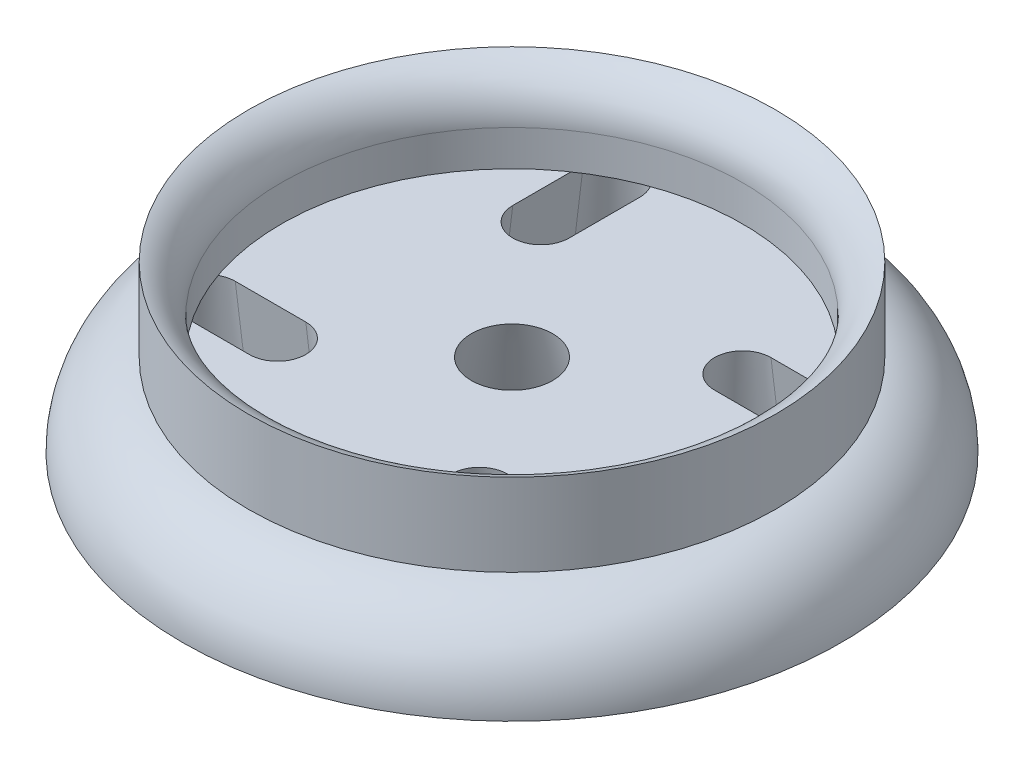
ISO-10303-21;
HEADER;
FILE_DESCRIPTION(('STEP AP214'),'2;1');
FILE_NAME('part.step','',(''),(''),'','','');
FILE_SCHEMA(('AUTOMOTIVE_DESIGN { 1 0 10303 214 1 1 1 1 }'));
ENDSEC;
DATA;
#1=APPLICATION_CONTEXT('core data for automotive mechanical design processes');
#2=APPLICATION_PROTOCOL_DEFINITION('international standard','automotive_design',2000,#1);
#3=PRODUCT_CONTEXT('',#1,'mechanical');
#4=PRODUCT('Part','Part','',(#3));
#5=PRODUCT_RELATED_PRODUCT_CATEGORY('part','',(#4));
#6=PRODUCT_DEFINITION_FORMATION('','',#4);
#7=PRODUCT_DEFINITION_CONTEXT('part definition',#1,'design');
#8=PRODUCT_DEFINITION('design','',#6,#7);
#9=PRODUCT_DEFINITION_SHAPE('','',#8);
#10=(LENGTH_UNIT() NAMED_UNIT(*) SI_UNIT(.MILLI.,.METRE.));
#11=(NAMED_UNIT(*) PLANE_ANGLE_UNIT() SI_UNIT($,.RADIAN.));
#12=(NAMED_UNIT(*) SI_UNIT($,.STERADIAN.) SOLID_ANGLE_UNIT());
#13=UNCERTAINTY_MEASURE_WITH_UNIT(LENGTH_MEASURE(1.E-05),#10,'distance_accuracy_value','');
#14=(GEOMETRIC_REPRESENTATION_CONTEXT(3) GLOBAL_UNCERTAINTY_ASSIGNED_CONTEXT((#13)) GLOBAL_UNIT_ASSIGNED_CONTEXT((#10,
#11,#12)) REPRESENTATION_CONTEXT('',''));
#15=CARTESIAN_POINT('',(0.,0.,0.));
#16=DIRECTION('',(0.,0.,1.));
#17=DIRECTION('',(1.,0.,0.));
#18=AXIS2_PLACEMENT_3D('',#15,#16,#17);
#19=CARTESIAN_POINT('',(0.,5.,0.));
#20=DIRECTION('',(0.,1.,0.));
#21=DIRECTION('',(0.,0.,1.));
#22=AXIS2_PLACEMENT_3D('',#19,#20,#21);
#23=PLANE('',#22);
#24=CARTESIAN_POINT('',(0.,5.,0.));
#25=DIRECTION('',(0.,1.,0.));
#26=DIRECTION('',(1.,0.,0.));
#27=AXIS2_PLACEMENT_3D('',#24,#25,#26);
#28=CIRCLE('',#27,16.);
#29=CARTESIAN_POINT('',(16.,5.,0.));
#30=VERTEX_POINT('',#29);
#31=EDGE_CURVE('E58',#30,#30,#28,.T.);
#32=ORIENTED_EDGE('',*,*,#31,.F.);
#33=EDGE_LOOP('',(#32));
#34=FACE_BOUND('',#33,.T.);
#35=CARTESIAN_POINT('',(0.,5.,0.));
#36=DIRECTION('',(0.,1.,0.));
#37=DIRECTION('',(0.,0.,1.));
#38=AXIS2_PLACEMENT_3D('',#35,#36,#37);
#39=CIRCLE('',#38,14.);
#40=CARTESIAN_POINT('',(0.,5.,14.));
#41=VERTEX_POINT('',#40);
#42=EDGE_CURVE('E63',#41,#41,#39,.T.);
#43=ORIENTED_EDGE('',*,*,#42,.T.);
#44=EDGE_LOOP('',(#43));
#45=FACE_BOUND('',#44,.T.);
#46=ADVANCED_FACE('F47',(#34,#45),#23,.F.);
#47=CARTESIAN_POINT('',(0.,10.,0.));
#48=DIRECTION('',(0.,-1.,0.));
#49=DIRECTION('',(0.,0.,-1.));
#50=AXIS2_PLACEMENT_3D('',#47,#48,#49);
#51=CYLINDRICAL_SURFACE('',#50,16.);
#52=CARTESIAN_POINT('',(0.,10.,0.));
#53=DIRECTION('',(0.,1.,0.));
#54=DIRECTION('',(1.,0.,0.));
#55=AXIS2_PLACEMENT_3D('',#52,#53,#54);
#56=CIRCLE('',#55,16.);
#57=CARTESIAN_POINT('',(16.,10.,0.));
#58=VERTEX_POINT('',#57);
#59=EDGE_CURVE('E54',#58,#58,#56,.T.);
#60=ORIENTED_EDGE('',*,*,#59,.F.);
#61=EDGE_LOOP('',(#60));
#62=FACE_BOUND('',#61,.T.);
#63=ORIENTED_EDGE('',*,*,#31,.T.);
#64=EDGE_LOOP('',(#63));
#65=FACE_BOUND('',#64,.T.);
#66=ADVANCED_FACE('F71',(#62,#65),#51,.T.);
#67=CARTESIAN_POINT('',(0.,10.,0.));
#68=DIRECTION('',(0.,-1.,0.));
#69=DIRECTION('',(0.,0.,-1.));
#70=AXIS2_PLACEMENT_3D('',#67,#68,#69);
#71=CYLINDRICAL_SURFACE('',#70,14.);
#72=CARTESIAN_POINT('',(0.,7.17157287525381,0.));
#73=DIRECTION('',(0.,1.,0.));
#74=DIRECTION('',(0.,0.,1.));
#75=AXIS2_PLACEMENT_3D('',#72,#73,#74);
#76=CIRCLE('',#75,14.);
#77=CARTESIAN_POINT('',(0.,7.17157287525381,14.));
#78=VERTEX_POINT('',#77);
#79=EDGE_CURVE('E12',#78,#78,#76,.T.);
#80=ORIENTED_EDGE('',*,*,#79,.T.);
#81=EDGE_LOOP('',(#80));
#82=FACE_BOUND('',#81,.T.);
#83=ORIENTED_EDGE('',*,*,#42,.F.);
#84=EDGE_LOOP('',(#83));
#85=FACE_BOUND('',#84,.T.);
#86=ADVANCED_FACE('F69',(#82,#85),#71,.F.);
#87=CARTESIAN_POINT('',(0.,7.17157287525381,0.));
#88=DIRECTION('',(0.,1.,0.));
#89=DIRECTION('',(0.,0.,1.));
#90=AXIS2_PLACEMENT_3D('',#87,#88,#89);
#91=TOROIDAL_SURFACE('',#90,17.,3.);
#92=ORIENTED_EDGE('',*,*,#59,.T.);
#93=EDGE_LOOP('',(#92));
#94=FACE_BOUND('',#93,.T.);
#95=ORIENTED_EDGE('',*,*,#79,.F.);
#96=EDGE_LOOP('',(#95));
#97=FACE_BOUND('',#96,.T.);
#98=ADVANCED_FACE('F49',(#94,#97),#91,.T.);
#99=CLOSED_SHELL('',(#46,#66,#86,#98));
#100=MANIFOLD_SOLID_BREP('B2',#99);
#101=CARTESIAN_POINT('',(0.,5.,0.));
#102=DIRECTION('',(0.,1.,0.));
#103=DIRECTION('',(0.,0.,1.));
#104=AXIS2_PLACEMENT_3D('',#101,#102,#103);
#105=PLANE('',#104);
#106=CARTESIAN_POINT('',(0.,5.,0.));
#107=DIRECTION('',(0.,1.,0.));
#108=DIRECTION('',(0.,0.,1.));
#109=AXIS2_PLACEMENT_3D('',#106,#107,#108);
#110=CIRCLE('',#109,2.46735385671982);
#111=CARTESIAN_POINT('',(0.,5.,2.46735385671982));
#112=VERTEX_POINT('',#111);
#113=EDGE_CURVE('E295',#112,#112,#110,.F.);
#114=ORIENTED_EDGE('',*,*,#113,.T.);
#115=EDGE_LOOP('',(#114));
#116=FACE_BOUND('',#115,.T.);
#117=CARTESIAN_POINT('',(12.1577030932826,5.,-6.12256372093332));
#118=DIRECTION('',(0.,1.,0.));
#119=DIRECTION('',(0.,0.,1.));
#120=AXIS2_PLACEMENT_3D('',#117,#118,#119);
#121=CIRCLE('',#120,1.71192932573659);
#122=CARTESIAN_POINT('',(12.8910571703802,5.,-7.66946184748246));
#123=VERTEX_POINT('',#122);
#124=CARTESIAN_POINT('',(12.1577030932826,5.,-7.83449304666991));
#125=VERTEX_POINT('',#124);
#126=EDGE_CURVE('E263',#123,#125,#121,.T.);
#127=ORIENTED_EDGE('',*,*,#126,.F.);
#128=CARTESIAN_POINT('',(0.,5.,0.));
#129=DIRECTION('',(0.,1.,0.));
#130=DIRECTION('',(0.,0.,1.));
#131=AXIS2_PLACEMENT_3D('',#128,#129,#130);
#132=CIRCLE('',#131,15.);
#133=CARTESIAN_POINT('',(-5.67121512916961,5.,-13.8865877363259));
#134=VERTEX_POINT('',#133);
#135=EDGE_CURVE('E331',#123,#134,#132,.T.);
#136=ORIENTED_EDGE('',*,*,#135,.T.);
#137=CARTESIAN_POINT('',(-6.23502692176227,5.,-12.2701662941116));
#138=DIRECTION('',(0.,1.,0.));
#139=DIRECTION('',(0.,0.,1.));
#140=AXIS2_PLACEMENT_3D('',#137,#138,#139);
#141=CIRCLE('',#140,1.71192932573659);
#142=CARTESIAN_POINT('',(-4.52309759602568,5.,-12.2701662941116));
#143=VERTEX_POINT('',#142);
#144=EDGE_CURVE('E300',#143,#134,#141,.T.);
#145=ORIENTED_EDGE('',*,*,#144,.F.);
#146=DIRECTION('',(0.,0.,-1.));
#147=VECTOR('',#146,1.);
#148=CARTESIAN_POINT('',(-4.52309759602571,5.,0.));
#149=LINE('',#148,#147);
#150=CARTESIAN_POINT('',(-4.52309759602568,5.,-7.99251536859424));
#151=VERTEX_POINT('',#150);
#152=EDGE_CURVE('E404',#143,#151,#149,.F.);
#153=ORIENTED_EDGE('',*,*,#152,.T.);
#154=CARTESIAN_POINT('',(-6.23502692176227,5.,-7.99251536859424));
#155=DIRECTION('',(0.,1.,0.));
#156=DIRECTION('',(0.,0.,1.));
#157=AXIS2_PLACEMENT_3D('',#154,#155,#156);
#158=CIRCLE('',#157,1.71192932573659);
#159=CARTESIAN_POINT('',(-7.94695624749887,5.,-7.99251536859424));
#160=VERTEX_POINT('',#159);
#161=EDGE_CURVE('E407',#160,#151,#158,.T.);
#162=ORIENTED_EDGE('',*,*,#161,.F.);
#163=DIRECTION('',(0.,0.,1.));
#164=VECTOR('',#163,1.);
#165=CARTESIAN_POINT('',(-7.94695624749888,5.,0.));
#166=LINE('',#165,#164);
#167=CARTESIAN_POINT('',(-7.94695624749886,5.,-12.2701662941116));
#168=VERTEX_POINT('',#167);
#169=EDGE_CURVE('E410',#168,#160,#166,.T.);
#170=ORIENTED_EDGE('',*,*,#169,.F.);
#171=CARTESIAN_POINT('',(-6.23502692176227,5.,-12.2701662941116));
#172=DIRECTION('',(0.,1.,0.));
#173=DIRECTION('',(0.,0.,1.));
#174=AXIS2_PLACEMENT_3D('',#171,#172,#173);
#175=CIRCLE('',#174,1.71192932573659);
#176=CARTESIAN_POINT('',(-7.87305253723181,5.,-12.7677344797731));
#177=VERTEX_POINT('',#176);
#178=EDGE_CURVE('E403',#177,#168,#175,.T.);
#179=ORIENTED_EDGE('',*,*,#178,.F.);
#180=CARTESIAN_POINT('',(0.,5.,0.));
#181=DIRECTION('',(0.,1.,0.));
#182=DIRECTION('',(0.,0.,1.));
#183=AXIS2_PLACEMENT_3D('',#180,#181,#182);
#184=CIRCLE('',#183,15.);
#185=CARTESIAN_POINT('',(-13.9662103810918,5.,5.47219952040162));
#186=VERTEX_POINT('',#185);
#187=EDGE_CURVE('E329',#177,#186,#184,.T.);
#188=ORIENTED_EDGE('',*,*,#187,.T.);
#189=CARTESIAN_POINT('',(-12.3826294949405,5.,6.1225637209333));
#190=DIRECTION('',(0.,1.,0.));
#191=DIRECTION('',(0.,0.,1.));
#192=AXIS2_PLACEMENT_3D('',#189,#190,#191);
#193=CIRCLE('',#192,1.71192932573659);
#194=CARTESIAN_POINT('',(-12.3826294949405,5.,4.41063439519671));
#195=VERTEX_POINT('',#194);
#196=EDGE_CURVE('E389',#195,#186,#193,.T.);
#197=ORIENTED_EDGE('',*,*,#196,.F.);
#198=DIRECTION('',(-1.,0.,0.));
#199=VECTOR('',#198,1.);
#200=CARTESIAN_POINT('',(-12.3826294949405,5.,4.41063439519671));
#201=LINE('',#200,#199);
#202=CARTESIAN_POINT('',(-8.10497856942318,5.,4.4106343951967));
#203=VERTEX_POINT('',#202);
#204=EDGE_CURVE('E385',#195,#203,#201,.F.);
#205=ORIENTED_EDGE('',*,*,#204,.T.);
#206=CARTESIAN_POINT('',(-8.10497856942318,5.,6.12256372093329));
#207=DIRECTION('',(0.,1.,0.));
#208=DIRECTION('',(0.,0.,1.));
#209=AXIS2_PLACEMENT_3D('',#206,#207,#208);
#210=CIRCLE('',#209,1.71192932573659);
#211=CARTESIAN_POINT('',(-8.10497856942318,5.,7.83449304666989));
#212=VERTEX_POINT('',#211);
#213=EDGE_CURVE('E388',#212,#203,#210,.T.);
#214=ORIENTED_EDGE('',*,*,#213,.F.);
#215=DIRECTION('',(1.,0.,0.));
#216=VECTOR('',#215,1.);
#217=CARTESIAN_POINT('',(-12.3826294949405,5.,7.83449304666989));
#218=LINE('',#217,#216);
#219=CARTESIAN_POINT('',(-12.3826294949405,5.,7.83449304666989));
#220=VERTEX_POINT('',#219);
#221=EDGE_CURVE('E283',#220,#212,#218,.T.);
#222=ORIENTED_EDGE('',*,*,#221,.F.);
#223=CARTESIAN_POINT('',(-12.3826294949405,5.,6.1225637209333));
#224=DIRECTION('',(0.,1.,0.));
#225=DIRECTION('',(0.,0.,1.));
#226=AXIS2_PLACEMENT_3D('',#223,#224,#225);
#227=CIRCLE('',#226,1.71192932573659);
#228=CARTESIAN_POINT('',(-12.8272228758326,5.,7.77575419452789));
#229=VERTEX_POINT('',#228);
#230=EDGE_CURVE('E392',#229,#220,#227,.T.);
#231=ORIENTED_EDGE('',*,*,#230,.F.);
#232=CARTESIAN_POINT('',(0.,5.,0.));
#233=DIRECTION('',(0.,1.,0.));
#234=DIRECTION('',(0.,0.,1.));
#235=AXIS2_PLACEMENT_3D('',#232,#233,#234);
#236=CIRCLE('',#235,15.);
#237=CARTESIAN_POINT('',(5.57441685301844,5.,13.9257271533225));
#238=VERTEX_POINT('',#237);
#239=EDGE_CURVE('E327',#229,#238,#236,.T.);
#240=ORIENTED_EDGE('',*,*,#239,.T.);
#241=CARTESIAN_POINT('',(6.01010052010435,5.,12.2701662941115));
#242=DIRECTION('',(0.,1.,0.));
#243=DIRECTION('',(0.,0.,1.));
#244=AXIS2_PLACEMENT_3D('',#241,#242,#243);
#245=CIRCLE('',#244,1.71192932573659);
#246=CARTESIAN_POINT('',(4.29817119436776,5.,12.2701662941115));
#247=VERTEX_POINT('',#246);
#248=EDGE_CURVE('E375',#247,#238,#245,.T.);
#249=ORIENTED_EDGE('',*,*,#248,.F.);
#250=DIRECTION('',(0.,0.,1.));
#251=VECTOR('',#250,1.);
#252=CARTESIAN_POINT('',(4.29817119436777,5.,0.));
#253=LINE('',#252,#251);
#254=CARTESIAN_POINT('',(4.29817119436776,5.,7.9925153685942));
#255=VERTEX_POINT('',#254);
#256=EDGE_CURVE('E378',#247,#255,#253,.F.);
#257=ORIENTED_EDGE('',*,*,#256,.T.);
#258=CARTESIAN_POINT('',(6.01010052010435,5.,7.9925153685942));
#259=DIRECTION('',(0.,1.,0.));
#260=DIRECTION('',(0.,0.,1.));
#261=AXIS2_PLACEMENT_3D('',#258,#259,#260);
#262=CIRCLE('',#261,1.71192932573659);
#263=CARTESIAN_POINT('',(7.72202984584095,5.,7.9925153685942));
#264=VERTEX_POINT('',#263);
#265=EDGE_CURVE('E381',#264,#255,#262,.T.);
#266=ORIENTED_EDGE('',*,*,#265,.F.);
#267=DIRECTION('',(0.,0.,-1.));
#268=VECTOR('',#267,1.);
#269=CARTESIAN_POINT('',(7.72202984584096,5.,0.));
#270=LINE('',#269,#268);
#271=CARTESIAN_POINT('',(7.72202984584094,5.,12.2701662941115));
#272=VERTEX_POINT('',#271);
#273=EDGE_CURVE('E384',#272,#264,#270,.T.);
#274=ORIENTED_EDGE('',*,*,#273,.F.);
#275=CARTESIAN_POINT('',(6.01010052010435,5.,12.2701662941115));
#276=DIRECTION('',(0.,1.,0.));
#277=DIRECTION('',(0.,0.,1.));
#278=AXIS2_PLACEMENT_3D('',#275,#276,#277);
#279=CIRCLE('',#278,1.71192932573659);
#280=CARTESIAN_POINT('',(7.58519638980334,5.,12.940818974397));
#281=VERTEX_POINT('',#280);
#282=EDGE_CURVE('E320',#281,#272,#279,.T.);
#283=ORIENTED_EDGE('',*,*,#282,.F.);
#284=CARTESIAN_POINT('',(0.,5.,0.));
#285=DIRECTION('',(0.,1.,0.));
#286=DIRECTION('',(0.,0.,1.));
#287=AXIS2_PLACEMENT_3D('',#284,#285,#286);
#288=CIRCLE('',#287,15.);
#289=CARTESIAN_POINT('',(13.837167813735,5.00000000000002,-5.79075011501463));
#290=VERTEX_POINT('',#289);
#291=EDGE_CURVE('E324',#281,#290,#288,.T.);
#292=ORIENTED_EDGE('',*,*,#291,.T.);
#293=CARTESIAN_POINT('',(12.1577030932826,5.,-6.12256372093332));
#294=DIRECTION('',(0.,1.,0.));
#295=DIRECTION('',(0.,0.,1.));
#296=AXIS2_PLACEMENT_3D('',#293,#294,#295);
#297=CIRCLE('',#296,1.71192932573659);
#298=CARTESIAN_POINT('',(12.1577030932826,5.,-4.41063439519673));
#299=VERTEX_POINT('',#298);
#300=EDGE_CURVE('E255',#299,#290,#297,.T.);
#301=ORIENTED_EDGE('',*,*,#300,.F.);
#302=DIRECTION('',(1.,0.,0.));
#303=VECTOR('',#302,1.);
#304=CARTESIAN_POINT('',(0.,5.,-4.41063439519676));
#305=LINE('',#304,#303);
#306=CARTESIAN_POINT('',(7.88005216776526,5.,-4.41063439519674));
#307=VERTEX_POINT('',#306);
#308=EDGE_CURVE('E340',#299,#307,#305,.F.);
#309=ORIENTED_EDGE('',*,*,#308,.T.);
#310=CARTESIAN_POINT('',(7.88005216776526,5.,-6.12256372093333));
#311=DIRECTION('',(0.,1.,0.));
#312=DIRECTION('',(0.,0.,1.));
#313=AXIS2_PLACEMENT_3D('',#310,#311,#312);
#314=CIRCLE('',#313,1.71192932573659);
#315=CARTESIAN_POINT('',(7.88005216776526,5.,-7.83449304666993));
#316=VERTEX_POINT('',#315);
#317=EDGE_CURVE('E338',#316,#307,#314,.T.);
#318=ORIENTED_EDGE('',*,*,#317,.F.);
#319=DIRECTION('',(-1.,0.,0.));
#320=VECTOR('',#319,1.);
#321=CARTESIAN_POINT('',(0.,5.,-7.83449304666995));
#322=LINE('',#321,#320);
#323=EDGE_CURVE('E336',#125,#316,#322,.T.);
#324=ORIENTED_EDGE('',*,*,#323,.F.);
#325=EDGE_LOOP('',(#127,#136,#145,#153,#162,#170,#179,#188,#197,#205,#214,#222,#231,#240,#249,
#257,#266,#274,#283,#292,#301,#309,#318,#324));
#326=FACE_BOUND('',#325,.T.);
#327=ADVANCED_FACE('F109',(#116,#326),#105,.T.);
#328=CARTESIAN_POINT('',(0.,0.,0.));
#329=DIRECTION('',(0.,1.,0.));
#330=DIRECTION('',(0.,0.,1.));
#331=AXIS2_PLACEMENT_3D('',#328,#329,#330);
#332=PLANE('',#331);
#333=CARTESIAN_POINT('',(0.,0.,0.));
#334=DIRECTION('',(0.,-1.,0.));
#335=DIRECTION('',(0.,0.,-1.));
#336=AXIS2_PLACEMENT_3D('',#333,#334,#335);
#337=CIRCLE('',#336,3.80709981887543);
#338=CARTESIAN_POINT('',(0.,0.,-3.80709981887543));
#339=VERTEX_POINT('',#338);
#340=EDGE_CURVE('E291',#339,#339,#337,.T.);
#341=ORIENTED_EDGE('',*,*,#340,.F.);
#342=EDGE_LOOP('',(#341));
#343=FACE_BOUND('',#342,.T.);
#344=CARTESIAN_POINT('',(12.1577030932826,0.,-6.12256372093332));
#345=DIRECTION('',(0.,-1.,0.));
#346=DIRECTION('',(0.,0.,-1.));
#347=AXIS2_PLACEMENT_3D('',#344,#345,#346);
#348=CIRCLE('',#347,2.32585213025111);
#349=CARTESIAN_POINT('',(12.1577030932826,0.,-3.79671159068221));
#350=VERTEX_POINT('',#349);
#351=CARTESIAN_POINT('',(12.1577030932826,0.,-8.44841585118444));
#352=VERTEX_POINT('',#351);
#353=EDGE_CURVE('E260',#350,#352,#348,.F.);
#354=ORIENTED_EDGE('',*,*,#353,.T.);
#355=DIRECTION('',(-1.,0.,0.));
#356=VECTOR('',#355,1.);
#357=CARTESIAN_POINT('',(0.,0.,-8.44841585118448));
#358=LINE('',#357,#356);
#359=CARTESIAN_POINT('',(7.88005216776526,0.,-8.44841585118445));
#360=VERTEX_POINT('',#359);
#361=EDGE_CURVE('E243',#352,#360,#358,.T.);
#362=ORIENTED_EDGE('',*,*,#361,.T.);
#363=CARTESIAN_POINT('',(7.88005216776526,0.,-6.12256372093333));
#364=DIRECTION('',(0.,-1.,0.));
#365=DIRECTION('',(0.,0.,-1.));
#366=AXIS2_PLACEMENT_3D('',#363,#364,#365);
#367=CIRCLE('',#366,2.32585213025112);
#368=CARTESIAN_POINT('',(7.88005216776526,0.,-3.79671159068222));
#369=VERTEX_POINT('',#368);
#370=EDGE_CURVE('E254',#360,#369,#367,.F.);
#371=ORIENTED_EDGE('',*,*,#370,.T.);
#372=DIRECTION('',(-1.,0.,0.));
#373=VECTOR('',#372,1.);
#374=CARTESIAN_POINT('',(0.,0.,-3.79671159068224));
#375=LINE('',#374,#373);
#376=EDGE_CURVE('E270',#350,#369,#375,.T.);
#377=ORIENTED_EDGE('',*,*,#376,.F.);
#378=EDGE_LOOP('',(#354,#362,#371,#377));
#379=FACE_BOUND('',#378,.T.);
#380=CARTESIAN_POINT('',(6.01010052010435,0.,12.2701662941115));
#381=DIRECTION('',(0.,-1.,0.));
#382=DIRECTION('',(0.,0.,-1.));
#383=AXIS2_PLACEMENT_3D('',#380,#381,#382);
#384=CIRCLE('',#383,2.32585213025111);
#385=CARTESIAN_POINT('',(3.68424838985324,0.,12.2701662941115));
#386=VERTEX_POINT('',#385);
#387=CARTESIAN_POINT('',(8.33595265035547,0.,12.2701662941115));
#388=VERTEX_POINT('',#387);
#389=EDGE_CURVE('E294',#386,#388,#384,.F.);
#390=ORIENTED_EDGE('',*,*,#389,.T.);
#391=DIRECTION('',(0.,0.,-1.));
#392=VECTOR('',#391,1.);
#393=CARTESIAN_POINT('',(8.33595265035549,0.,0.));
#394=LINE('',#393,#392);
#395=CARTESIAN_POINT('',(8.33595265035548,0.,7.9925153685942));
#396=VERTEX_POINT('',#395);
#397=EDGE_CURVE('E317',#388,#396,#394,.T.);
#398=ORIENTED_EDGE('',*,*,#397,.T.);
#399=CARTESIAN_POINT('',(6.01010052010435,0.,7.9925153685942));
#400=DIRECTION('',(0.,-1.,0.));
#401=DIRECTION('',(0.,0.,-1.));
#402=AXIS2_PLACEMENT_3D('',#399,#400,#401);
#403=CIRCLE('',#402,2.32585213025112);
#404=CARTESIAN_POINT('',(3.68424838985324,0.,7.9925153685942));
#405=VERTEX_POINT('',#404);
#406=EDGE_CURVE('E314',#396,#405,#403,.F.);
#407=ORIENTED_EDGE('',*,*,#406,.T.);
#408=DIRECTION('',(0.,0.,-1.));
#409=VECTOR('',#408,1.);
#410=CARTESIAN_POINT('',(3.68424838985325,0.,0.));
#411=LINE('',#410,#409);
#412=EDGE_CURVE('E311',#386,#405,#411,.T.);
#413=ORIENTED_EDGE('',*,*,#412,.F.);
#414=EDGE_LOOP('',(#390,#398,#407,#413));
#415=FACE_BOUND('',#414,.T.);
#416=CARTESIAN_POINT('',(0.,0.,0.));
#417=DIRECTION('',(0.,1.,0.));
#418=DIRECTION('',(0.,0.,1.));
#419=AXIS2_PLACEMENT_3D('',#416,#417,#418);
#420=CIRCLE('',#419,20.);
#421=CARTESIAN_POINT('',(0.,0.,20.));
#422=VERTEX_POINT('',#421);
#423=EDGE_CURVE('E321',#422,#422,#420,.T.);
#424=ORIENTED_EDGE('',*,*,#423,.F.);
#425=EDGE_LOOP('',(#424));
#426=FACE_BOUND('',#425,.T.);
#427=DIRECTION('',(1.,0.,0.));
#428=VECTOR('',#427,1.);
#429=CARTESIAN_POINT('',(-12.3826294949405,0.,8.44841585118441));
#430=LINE('',#429,#428);
#431=CARTESIAN_POINT('',(-12.3826294949405,0.,8.44841585118441));
#432=VERTEX_POINT('',#431);
#433=CARTESIAN_POINT('',(-8.10497856942318,0.,8.44841585118441));
#434=VERTEX_POINT('',#433);
#435=EDGE_CURVE('E264',#432,#434,#430,.T.);
#436=ORIENTED_EDGE('',*,*,#435,.T.);
#437=CARTESIAN_POINT('',(-8.10497856942318,0.,6.12256372093329));
#438=DIRECTION('',(0.,1.,0.));
#439=DIRECTION('',(0.,0.,1.));
#440=AXIS2_PLACEMENT_3D('',#437,#438,#439);
#441=CIRCLE('',#440,2.32585213025112);
#442=CARTESIAN_POINT('',(-8.10497856942318,0.,3.79671159068218));
#443=VERTEX_POINT('',#442);
#444=EDGE_CURVE('E286',#434,#443,#441,.T.);
#445=ORIENTED_EDGE('',*,*,#444,.T.);
#446=DIRECTION('',(1.,0.,0.));
#447=VECTOR('',#446,1.);
#448=CARTESIAN_POINT('',(-12.3826294949405,0.,3.79671159068218));
#449=LINE('',#448,#447);
#450=CARTESIAN_POINT('',(-12.3826294949405,0.,3.79671159068218));
#451=VERTEX_POINT('',#450);
#452=EDGE_CURVE('E282',#451,#443,#449,.T.);
#453=ORIENTED_EDGE('',*,*,#452,.F.);
#454=CARTESIAN_POINT('',(-12.3826294949405,0.,6.1225637209333));
#455=DIRECTION('',(0.,1.,0.));
#456=DIRECTION('',(0.,0.,1.));
#457=AXIS2_PLACEMENT_3D('',#454,#455,#456);
#458=CIRCLE('',#457,2.32585213025111);
#459=EDGE_CURVE('E279',#451,#432,#458,.T.);
#460=ORIENTED_EDGE('',*,*,#459,.T.);
#461=EDGE_LOOP('',(#436,#445,#453,#460));
#462=FACE_BOUND('',#461,.T.);
#463=CARTESIAN_POINT('',(-6.23502692176227,0.,-12.2701662941116));
#464=DIRECTION('',(0.,-1.,0.));
#465=DIRECTION('',(0.,0.,-1.));
#466=AXIS2_PLACEMENT_3D('',#463,#464,#465);
#467=CIRCLE('',#466,2.32585213025112);
#468=CARTESIAN_POINT('',(-3.90917479151115,0.,-12.2701662941116));
#469=VERTEX_POINT('',#468);
#470=CARTESIAN_POINT('',(-8.56087905201338,0.,-12.2701662941116));
#471=VERTEX_POINT('',#470);
#472=EDGE_CURVE('E306',#469,#471,#467,.F.);
#473=ORIENTED_EDGE('',*,*,#472,.T.);
#474=DIRECTION('',(0.,0.,1.));
#475=VECTOR('',#474,1.);
#476=CARTESIAN_POINT('',(-8.56087905201341,0.,0.));
#477=LINE('',#476,#475);
#478=CARTESIAN_POINT('',(-8.56087905201339,0.,-7.99251536859424));
#479=VERTEX_POINT('',#478);
#480=EDGE_CURVE('E296',#471,#479,#477,.T.);
#481=ORIENTED_EDGE('',*,*,#480,.T.);
#482=CARTESIAN_POINT('',(-6.23502692176227,0.,-7.99251536859424));
#483=DIRECTION('',(0.,-1.,0.));
#484=DIRECTION('',(0.,0.,-1.));
#485=AXIS2_PLACEMENT_3D('',#482,#483,#484);
#486=CIRCLE('',#485,2.32585213025112);
#487=CARTESIAN_POINT('',(-3.90917479151116,0.,-7.99251536859424));
#488=VERTEX_POINT('',#487);
#489=EDGE_CURVE('E299',#479,#488,#486,.F.);
#490=ORIENTED_EDGE('',*,*,#489,.T.);
#491=DIRECTION('',(0.,0.,1.));
#492=VECTOR('',#491,1.);
#493=CARTESIAN_POINT('',(-3.90917479151118,0.,0.));
#494=LINE('',#493,#492);
#495=EDGE_CURVE('E303',#469,#488,#494,.T.);
#496=ORIENTED_EDGE('',*,*,#495,.F.);
#497=EDGE_LOOP('',(#473,#481,#490,#496));
#498=FACE_BOUND('',#497,.T.);
#499=ADVANCED_FACE('F267',(#343,#379,#415,#426,#462,#498),#332,.F.);
#500=CARTESIAN_POINT('',(6.01010052010435,0.,12.2701662941115));
#501=DIRECTION('',(0.,-1.,0.));
#502=DIRECTION('',(0.,0.,-1.));
#503=AXIS2_PLACEMENT_3D('',#500,#501,#502);
#504=CONICAL_SURFACE('',#503,2.32585213025111,0.122173047639603);
#505=ORIENTED_EDGE('',*,*,#248,.T.);
#506=CARTESIAN_POINT('',(5.06577889511161,4.98452486813294,13.7003648796286));
#507=CARTESIAN_POINT('',(5.10629309714609,4.98757905324711,13.7266669040154));
#508=CARTESIAN_POINT('',(5.14789325921203,4.99009186087264,13.7513151431497));
#509=CARTESIAN_POINT('',(5.23300867734325,4.99418367418365,13.7971283600237));
#510=CARTESIAN_POINT('',(5.27652376821847,4.99576276024699,13.818293637475));
#511=CARTESIAN_POINT('',(5.409434434456,4.99931990797488,13.8762501021052));
#512=CARTESIAN_POINT('',(5.50131805532115,5.00012609528134,13.9075815813908));
#513=CARTESIAN_POINT('',(5.68912258611637,4.99984166804454,13.9545476476379));
#514=CARTESIAN_POINT('',(5.78504992203657,4.99874791414757,13.9701561875733));
#515=CARTESIAN_POINT('',(5.97814745504249,4.99582892728244,13.9850435119583));
#516=CARTESIAN_POINT('',(6.0753173668585,4.99400385939048,13.9843259795806));
#517=CARTESIAN_POINT('',(6.26807412199906,4.99058414499301,13.9664784081634));
#518=CARTESIAN_POINT('',(6.36366205549879,4.98898933341361,13.9493601949029));
#519=CARTESIAN_POINT('',(6.55056269144083,4.9866786288792,13.8991436151885));
#520=CARTESIAN_POINT('',(6.64187537939824,4.98596273890184,13.8660451945966));
#521=CARTESIAN_POINT('',(6.816546807475,4.98567457778727,13.785266091404));
#522=CARTESIAN_POINT('',(6.89998387270754,4.98608945502404,13.7377546886369));
#523=CARTESIAN_POINT('',(7.0577152942291,4.98788759163956,13.6293780738309));
#524=CARTESIAN_POINT('',(7.13200624836707,4.98927121009654,13.568507915918));
#525=CARTESIAN_POINT('',(7.26928220581154,4.99247474086946,13.4352742260379));
#526=CARTESIAN_POINT('',(7.33227697073614,4.99429427328189,13.3629207203578));
#527=CARTESIAN_POINT('',(7.44527104072904,4.99752060273851,13.2088470398466));
#528=CARTESIAN_POINT('',(7.49529460373257,4.9989281708569,13.1271447671897));
#529=CARTESIAN_POINT('',(7.55497894411457,4.99985224390401,13.0087548671183));
#530=CARTESIAN_POINT('',(7.57064577756727,4.99999855368216,12.9750136238871));
#531=CARTESIAN_POINT('',(7.58519638980334,5.,12.940818974397));
#532=B_SPLINE_CURVE_WITH_KNOTS('',3,(#506,#507,#508,#509,#510,#511,#512,#513,#514,#515,#516,
#517,#518,#519,#520,#521,#522,#523,#524,#525,#526,#527,#528,#529,#530,#531),.UNSPECIFIED.,.F.,
.F.,(4,2,2,2,2,2,2,2,2,2,2,2,4),(0.,0.145108660779468,0.290204828301863,0.579963314005611,
0.870201035525284,1.16037327987136,1.45033645165732,1.74030060579252,2.02698298383971,
2.31377168123467,2.60031134275367,2.88631120653742,2.99783073912681),.UNSPECIFIED.);
#533=EDGE_CURVE('E119',#238,#281,#532,.T.);
#534=ORIENTED_EDGE('',*,*,#533,.T.);
#535=ORIENTED_EDGE('',*,*,#282,.T.);
#536=DIRECTION('',(-0.121869343405148,0.992546151641322,0.));
#537=VECTOR('',#536,1.);
#538=CARTESIAN_POINT('',(8.33595265035547,0.,12.2701662941115));
#539=LINE('',#538,#537);
#540=EDGE_CURVE('E325',#272,#388,#539,.F.);
#541=ORIENTED_EDGE('',*,*,#540,.T.);
#542=ORIENTED_EDGE('',*,*,#389,.F.);
#543=DIRECTION('',(0.121869343405148,0.992546151641322,0.));
#544=VECTOR('',#543,1.);
#545=CARTESIAN_POINT('',(3.68424838985324,0.,12.2701662941115));
#546=LINE('',#545,#544);
#547=EDGE_CURVE('E523',#247,#386,#546,.F.);
#548=ORIENTED_EDGE('',*,*,#547,.F.);
#549=EDGE_LOOP('',(#505,#534,#535,#541,#542,#548));
#550=FACE_BOUND('',#549,.T.);
#551=ADVANCED_FACE('F358',(#550),#504,.F.);
#552=CARTESIAN_POINT('',(8.33595265035549,0.,0.));
#553=DIRECTION('',(-0.992546151641322,-0.121869343405148,0.));
#554=DIRECTION('',(0.121869343405148,-0.992546151641322,0.));
#555=AXIS2_PLACEMENT_3D('',#552,#553,#554);
#556=PLANE('',#555);
#557=ORIENTED_EDGE('',*,*,#397,.F.);
#558=ORIENTED_EDGE('',*,*,#540,.F.);
#559=ORIENTED_EDGE('',*,*,#273,.T.);
#560=DIRECTION('',(-0.121869343405148,0.992546151641322,0.));
#561=VECTOR('',#560,1.);
#562=CARTESIAN_POINT('',(8.33595265035548,0.,7.9925153685942));
#563=LINE('',#562,#561);
#564=EDGE_CURVE('E536',#264,#396,#563,.F.);
#565=ORIENTED_EDGE('',*,*,#564,.T.);
#566=EDGE_LOOP('',(#557,#558,#559,#565));
#567=FACE_BOUND('',#566,.T.);
#568=ADVANCED_FACE('F362',(#567),#556,.T.);
#569=CARTESIAN_POINT('',(6.01010052010435,0.,7.9925153685942));
#570=DIRECTION('',(0.,-1.,0.));
#571=DIRECTION('',(0.,0.,-1.));
#572=AXIS2_PLACEMENT_3D('',#569,#570,#571);
#573=CONICAL_SURFACE('',#572,2.32585213025112,0.122173047639603);
#574=ORIENTED_EDGE('',*,*,#406,.F.);
#575=ORIENTED_EDGE('',*,*,#564,.F.);
#576=ORIENTED_EDGE('',*,*,#265,.T.);
#577=DIRECTION('',(0.121869343405148,0.992546151641322,0.));
#578=VECTOR('',#577,1.);
#579=CARTESIAN_POINT('',(3.68424838985324,0.,7.9925153685942));
#580=LINE('',#579,#578);
#581=EDGE_CURVE('E525',#255,#405,#580,.F.);
#582=ORIENTED_EDGE('',*,*,#581,.T.);
#583=EDGE_LOOP('',(#574,#575,#576,#582));
#584=FACE_BOUND('',#583,.T.);
#585=ADVANCED_FACE('F111',(#584),#573,.F.);
#586=CARTESIAN_POINT('',(3.68424838985325,0.,0.));
#587=DIRECTION('',(0.992546151641322,-0.121869343405148,0.));
#588=DIRECTION('',(0.121869343405148,0.992546151641322,0.));
#589=AXIS2_PLACEMENT_3D('',#586,#587,#588);
#590=PLANE('',#589);
#591=ORIENTED_EDGE('',*,*,#412,.T.);
#592=ORIENTED_EDGE('',*,*,#581,.F.);
#593=ORIENTED_EDGE('',*,*,#256,.F.);
#594=ORIENTED_EDGE('',*,*,#547,.T.);
#595=EDGE_LOOP('',(#591,#592,#593,#594));
#596=FACE_BOUND('',#595,.T.);
#597=ADVANCED_FACE('F453',(#596),#590,.T.);
#598=CARTESIAN_POINT('',(-12.3826294949405,0.,8.44841585118441));
#599=DIRECTION('',(0.,-0.121869343405148,-0.992546151641322));
#600=DIRECTION('',(0.,0.992546151641322,-0.121869343405148));
#601=AXIS2_PLACEMENT_3D('',#598,#599,#600);
#602=PLANE('',#601);
#603=ORIENTED_EDGE('',*,*,#435,.F.);
#604=DIRECTION('',(0.,0.992546151641322,-0.121869343405148));
#605=VECTOR('',#604,1.);
#606=CARTESIAN_POINT('',(-12.3826294949405,0.,8.44841585118441));
#607=LINE('',#606,#605);
#608=EDGE_CURVE('E394',#220,#432,#607,.F.);
#609=ORIENTED_EDGE('',*,*,#608,.F.);
#610=ORIENTED_EDGE('',*,*,#221,.T.);
#611=DIRECTION('',(0.,0.992546151641322,-0.121869343405148));
#612=VECTOR('',#611,1.);
#613=CARTESIAN_POINT('',(-8.10497856942318,0.,8.44841585118442));
#614=LINE('',#613,#612);
#615=EDGE_CURVE('E494',#212,#434,#614,.F.);
#616=ORIENTED_EDGE('',*,*,#615,.T.);
#617=EDGE_LOOP('',(#603,#609,#610,#616));
#618=FACE_BOUND('',#617,.T.);
#619=ADVANCED_FACE('F456',(#618),#602,.T.);
#620=CARTESIAN_POINT('',(-8.10497856942318,0.,6.12256372093329));
#621=DIRECTION('',(0.,-1.,0.));
#622=DIRECTION('',(0.,0.,1.));
#623=AXIS2_PLACEMENT_3D('',#620,#621,#622);
#624=CONICAL_SURFACE('',#623,2.32585213025112,0.122173047639603);
#625=ORIENTED_EDGE('',*,*,#444,.F.);
#626=ORIENTED_EDGE('',*,*,#615,.F.);
#627=ORIENTED_EDGE('',*,*,#213,.T.);
#628=DIRECTION('',(0.,0.992546151641322,0.121869343405148));
#629=VECTOR('',#628,1.);
#630=CARTESIAN_POINT('',(-8.10497856942318,0.,3.79671159068218));
#631=LINE('',#630,#629);
#632=EDGE_CURVE('E491',#203,#443,#631,.F.);
#633=ORIENTED_EDGE('',*,*,#632,.T.);
#634=EDGE_LOOP('',(#625,#626,#627,#633));
#635=FACE_BOUND('',#634,.T.);
#636=ADVANCED_FACE('F448',(#635),#624,.F.);
#637=CARTESIAN_POINT('',(-12.3826294949405,0.,3.79671159068218));
#638=DIRECTION('',(0.,-0.121869343405148,0.992546151641322));
#639=DIRECTION('',(0.,-0.992546151641322,-0.121869343405148));
#640=AXIS2_PLACEMENT_3D('',#637,#638,#639);
#641=PLANE('',#640);
#642=ORIENTED_EDGE('',*,*,#452,.T.);
#643=ORIENTED_EDGE('',*,*,#632,.F.);
#644=ORIENTED_EDGE('',*,*,#204,.F.);
#645=DIRECTION('',(0.,0.992546151641322,0.121869343405148));
#646=VECTOR('',#645,1.);
#647=CARTESIAN_POINT('',(-12.3826294949405,0.,3.79671159068218));
#648=LINE('',#647,#646);
#649=EDGE_CURVE('E488',#195,#451,#648,.F.);
#650=ORIENTED_EDGE('',*,*,#649,.T.);
#651=EDGE_LOOP('',(#642,#643,#644,#650));
#652=FACE_BOUND('',#651,.T.);
#653=ADVANCED_FACE('F445',(#652),#641,.T.);
#654=CARTESIAN_POINT('',(-12.3826294949405,0.,6.1225637209333));
#655=DIRECTION('',(0.,-1.,0.));
#656=DIRECTION('',(0.,0.,1.));
#657=AXIS2_PLACEMENT_3D('',#654,#655,#656);
#658=CONICAL_SURFACE('',#657,2.32585213025111,0.122173047639603);
#659=ORIENTED_EDGE('',*,*,#196,.T.);
#660=CARTESIAN_POINT('',(-13.8578876917292,4.99676560057755,5.25326793778847));
#661=CARTESIAN_POINT('',(-13.882184435065,4.99811370132649,5.29482656151993));
#662=CARTESIAN_POINT('',(-13.9047706953677,4.998997721021,5.33737294851076));
#663=CARTESIAN_POINT('',(-13.9463707143615,4.99999331178573,5.42418241733752));
#664=CARTESIAN_POINT('',(-13.965384756496,5.00010494416744,5.46844536263389));
#665=CARTESIAN_POINT('',(-14.0168048438754,4.99951546511594,5.60332126280017));
#666=CARTESIAN_POINT('',(-14.0436488274318,4.99789250377531,5.69612389081529));
#667=CARTESIAN_POINT('',(-14.0816556205941,4.99342746995285,5.88552595029313));
#668=CARTESIAN_POINT('',(-14.0927014905374,4.99057650736826,5.98214831004677));
#669=CARTESIAN_POINT('',(-14.0983290993975,4.9848232393971,6.17585920222716));
#670=CARTESIAN_POINT('',(-14.092915851529,4.98192094991169,6.27294758371642));
#671=CARTESIAN_POINT('',(-14.0657304877606,4.97699835603528,6.46441593545182));
#672=CARTESIAN_POINT('',(-14.0440271480288,4.97497439989219,6.55880556532033));
#673=CARTESIAN_POINT('',(-13.9848945358951,4.97236212169141,6.74255803943936));
#674=CARTESIAN_POINT('',(-13.9474643795302,4.97177388034414,6.8319206008114));
#675=CARTESIAN_POINT('',(-13.8585839489312,4.97218893313657,7.00178264205819));
#676=CARTESIAN_POINT('',(-13.80733584799,4.97317021212633,7.0823880791872));
#677=CARTESIAN_POINT('',(-13.6920805384504,4.97642276821373,7.2338771224166));
#678=CARTESIAN_POINT('',(-13.6280717936157,4.9786942006921,7.3047595562419));
#679=CARTESIAN_POINT('',(-13.4890990762881,4.98389331075777,7.43492113100771));
#680=CARTESIAN_POINT('',(-13.4141234906625,4.9868216857786,7.49418781403638));
#681=CARTESIAN_POINT('',(-13.2554114128714,4.99239117850486,7.59945249448527));
#682=CARTESIAN_POINT('',(-13.1716827440518,4.99503254849531,7.64546220488113));
#683=CARTESIAN_POINT('',(-13.0431326768552,4.99788475703938,7.7028862873497));
#684=CARTESIAN_POINT('',(-13.0007224684974,4.99864522749465,7.71984845602318));
#685=CARTESIAN_POINT('',(-12.9147755814505,4.99970227502529,7.75036001393551));
#686=CARTESIAN_POINT('',(-12.8712411633036,4.9999997189804,7.76391574071004));
#687=CARTESIAN_POINT('',(-12.8272228758326,5.,7.77575419452789));
#688=B_SPLINE_CURVE_WITH_KNOTS('',3,(#660,#661,#662,#663,#664,#665,#666,#667,#668,#669,#670,
#671,#672,#673,#674,#675,#676,#677,#678,#679,#680,#681,#682,#683,#684,#685,#686,#687),
.UNSPECIFIED.,.F.,.F.,(4,2,2,2,2,2,2,2,2,2,2,2,2,4),(0.,0.144387426837753,0.288763392183014,
0.577163171994391,0.867686867508399,1.15812208247511,1.44733793990548,1.73657005557332,
2.02178065851228,2.30702561832091,2.59257484955474,2.87787100945534,3.01479694810209,
3.15146622392286),.UNSPECIFIED.);
#689=EDGE_CURVE('E373',#186,#229,#688,.T.);
#690=ORIENTED_EDGE('',*,*,#689,.T.);
#691=ORIENTED_EDGE('',*,*,#230,.T.);
#692=ORIENTED_EDGE('',*,*,#608,.T.);
#693=ORIENTED_EDGE('',*,*,#459,.F.);
#694=ORIENTED_EDGE('',*,*,#649,.F.);
#695=EDGE_LOOP('',(#659,#690,#691,#692,#693,#694));
#696=FACE_BOUND('',#695,.T.);
#697=ADVANCED_FACE('F356',(#696),#658,.F.);
#698=CARTESIAN_POINT('',(12.1577030932826,0.,-6.12256372093332));
#699=DIRECTION('',(0.,-1.,0.));
#700=DIRECTION('',(0.,0.,-1.));
#701=AXIS2_PLACEMENT_3D('',#698,#699,#700);
#702=CONICAL_SURFACE('',#701,2.32585213025111,0.122173047639603);
#703=ORIENTED_EDGE('',*,*,#300,.T.);
#704=CARTESIAN_POINT('',(12.8910571703802,5.,-7.66946184748246));
#705=CARTESIAN_POINT('',(12.9346735136012,4.99999867480558,-7.64878402863351));
#706=CARTESIAN_POINT('',(12.9774056757741,4.99978295847874,-7.62629444188479));
#707=CARTESIAN_POINT('',(13.0608375718152,4.999058708429,-7.57782175733201));
#708=CARTESIAN_POINT('',(13.1015373070821,4.99855017490762,-7.55183866193208));
#709=CARTESIAN_POINT('',(13.2201233746565,4.99679031137111,-7.46889200762745));
#710=CARTESIAN_POINT('',(13.2945730059186,4.99530424498027,-7.40689481954415));
#711=CARTESIAN_POINT('',(13.4319722945234,4.99259085551128,-7.27121355038474));
#712=CARTESIAN_POINT('',(13.4949137559359,4.99136371674209,-7.19752120944498));
#713=CARTESIAN_POINT('',(13.6073868112842,4.98972733287336,-7.0405768065924));
#714=CARTESIAN_POINT('',(13.6569272494822,4.98931754720204,-6.95733110153441));
#715=CARTESIAN_POINT('',(13.740821289231,4.98948284183076,-6.78439436175486));
#716=CARTESIAN_POINT('',(13.7753010600155,4.99004953534887,-6.69476448896463));
#717=CARTESIAN_POINT('',(13.8287569909511,4.99191938194297,-6.51095772503451));
#718=CARTESIAN_POINT('',(13.8477237020375,4.99322298305603,-6.41677809955033));
#719=CARTESIAN_POINT('',(13.8696436135869,4.99596769948709,-6.22654365990974));
#720=CARTESIAN_POINT('',(13.8725985049344,4.99740880026845,-6.13048904483168));
#721=CARTESIAN_POINT('',(13.8650643587003,4.99899562132703,-5.98712891051873));
#722=CARTESIAN_POINT('',(13.8605541049983,4.99942881832316,-5.93944241245677));
#723=CARTESIAN_POINT('',(13.8475974195562,4.9999673807078,-5.84460497724472));
#724=CARTESIAN_POINT('',(13.8391509706251,5.00007274466452,-5.79745404243457));
#725=CARTESIAN_POINT('',(13.8287658042539,4.99994631647905,-5.7507115987775));
#726=B_SPLINE_CURVE_WITH_KNOTS('',3,(#704,#705,#706,#707,#708,#709,#710,#711,#712,#713,#714,
#715,#716,#717,#718,#719,#720,#721,#722,#723,#724,#725),.UNSPECIFIED.,.F.,.F.,(4,2,2,2,2,2,2,2,
2,2,4),(0.,0.144720799094172,0.289441498596373,0.578632298564999,0.868028260004651,
1.15723276045543,1.44396570573537,1.73087317137061,2.01775033833613,2.1613108274789,
2.30487194361128),.UNSPECIFIED.);
#727=EDGE_CURVE('E45',#290,#123,#726,.F.);
#728=ORIENTED_EDGE('',*,*,#727,.T.);
#729=ORIENTED_EDGE('',*,*,#126,.T.);
#730=DIRECTION('',(0.,0.992546151641322,0.121869343405148));
#731=VECTOR('',#730,1.);
#732=CARTESIAN_POINT('',(12.1577030932826,0.,-8.44841585118444));
#733=LINE('',#732,#731);
#734=EDGE_CURVE('E246',#125,#352,#733,.F.);
#735=ORIENTED_EDGE('',*,*,#734,.T.);
#736=ORIENTED_EDGE('',*,*,#353,.F.);
#737=DIRECTION('',(0.,0.992546151641322,-0.121869343405148));
#738=VECTOR('',#737,1.);
#739=CARTESIAN_POINT('',(12.1577030932826,0.,-3.79671159068221));
#740=LINE('',#739,#738);
#741=EDGE_CURVE('E339',#299,#350,#740,.F.);
#742=ORIENTED_EDGE('',*,*,#741,.F.);
#743=EDGE_LOOP('',(#703,#728,#729,#735,#736,#742));
#744=FACE_BOUND('',#743,.T.);
#745=ADVANCED_FACE('F259',(#744),#702,.F.);
#746=CARTESIAN_POINT('',(0.,0.,-8.44841585118448));
#747=DIRECTION('',(0.,-0.121869343405148,0.992546151641322));
#748=DIRECTION('',(0.,-0.992546151641322,-0.121869343405148));
#749=AXIS2_PLACEMENT_3D('',#746,#747,#748);
#750=PLANE('',#749);
#751=ORIENTED_EDGE('',*,*,#361,.F.);
#752=ORIENTED_EDGE('',*,*,#734,.F.);
#753=ORIENTED_EDGE('',*,*,#323,.T.);
#754=DIRECTION('',(0.,0.992546151641322,0.121869343405148));
#755=VECTOR('',#754,1.);
#756=CARTESIAN_POINT('',(7.88005216776526,0.,-8.44841585118445));
#757=LINE('',#756,#755);
#758=EDGE_CURVE('E249',#316,#360,#757,.F.);
#759=ORIENTED_EDGE('',*,*,#758,.T.);
#760=EDGE_LOOP('',(#751,#752,#753,#759));
#761=FACE_BOUND('',#760,.T.);
#762=ADVANCED_FACE('F245',(#761),#750,.T.);
#763=CARTESIAN_POINT('',(7.88005216776526,0.,-6.12256372093333));
#764=DIRECTION('',(0.,-1.,0.));
#765=DIRECTION('',(0.,0.,-1.));
#766=AXIS2_PLACEMENT_3D('',#763,#764,#765);
#767=CONICAL_SURFACE('',#766,2.32585213025112,0.122173047639603);
#768=ORIENTED_EDGE('',*,*,#370,.F.);
#769=ORIENTED_EDGE('',*,*,#758,.F.);
#770=ORIENTED_EDGE('',*,*,#317,.T.);
#771=DIRECTION('',(0.,0.992546151641322,-0.121869343405148));
#772=VECTOR('',#771,1.);
#773=CARTESIAN_POINT('',(7.88005216776526,0.,-3.79671159068221));
#774=LINE('',#773,#772);
#775=EDGE_CURVE('E531',#307,#369,#774,.F.);
#776=ORIENTED_EDGE('',*,*,#775,.T.);
#777=EDGE_LOOP('',(#768,#769,#770,#776));
#778=FACE_BOUND('',#777,.T.);
#779=ADVANCED_FACE('F427',(#778),#767,.F.);
#780=CARTESIAN_POINT('',(0.,0.,-3.79671159068224));
#781=DIRECTION('',(0.,-0.121869343405148,-0.992546151641322));
#782=DIRECTION('',(0.,0.992546151641322,-0.121869343405148));
#783=AXIS2_PLACEMENT_3D('',#780,#781,#782);
#784=PLANE('',#783);
#785=ORIENTED_EDGE('',*,*,#376,.T.);
#786=ORIENTED_EDGE('',*,*,#775,.F.);
#787=ORIENTED_EDGE('',*,*,#308,.F.);
#788=ORIENTED_EDGE('',*,*,#741,.T.);
#789=EDGE_LOOP('',(#785,#786,#787,#788));
#790=FACE_BOUND('',#789,.T.);
#791=ADVANCED_FACE('F424',(#790),#784,.T.);
#792=CARTESIAN_POINT('',(-6.23502692176227,0.,-12.2701662941116));
#793=DIRECTION('',(0.,-1.,0.));
#794=DIRECTION('',(0.,0.,-1.));
#795=AXIS2_PLACEMENT_3D('',#792,#793,#794);
#796=CONICAL_SURFACE('',#795,2.32585213025112,0.122173047639603);
#797=ORIENTED_EDGE('',*,*,#144,.T.);
#798=CARTESIAN_POINT('',(-5.67121512916961,5.,-13.8865877363259));
#799=CARTESIAN_POINT('',(-5.71692141501491,4.99999939692103,-13.9025300586517));
#800=CARTESIAN_POINT('',(-5.76326967249123,4.99969213989883,-13.9165607938446));
#801=CARTESIAN_POINT('',(-5.85696942516777,4.99861999598519,-13.940704436413));
#802=CARTESIAN_POINT('',(-5.90432090086419,4.99785511798261,-13.950817419881));
#803=CARTESIAN_POINT('',(-6.04735264099616,4.9951096337448,-13.9751200371531));
#804=CARTESIAN_POINT('',(-6.14411608662716,4.99267746270769,-13.9833102386904));
#805=CARTESIAN_POINT('',(-6.33766434316872,4.98773782589646,-13.9832656370484));
#806=CARTESIAN_POINT('',(-6.43444911897518,4.98523030697371,-13.9750189584515));
#807=CARTESIAN_POINT('',(-6.62521750644358,4.98101921196671,-13.9422292658622));
#808=CARTESIAN_POINT('',(-6.71920220708407,4.97931531941689,-13.9176926759663));
#809=CARTESIAN_POINT('',(-6.90072681283084,4.97724689216799,-13.8532972280336));
#810=CARTESIAN_POINT('',(-6.98832147763399,4.97686921703647,-13.8135930439497));
#811=CARTESIAN_POINT('',(-7.15556600897295,4.97752582506282,-13.7199760415901));
#812=CARTESIAN_POINT('',(-7.23521505700063,4.97856025352598,-13.6660617615578));
#813=CARTESIAN_POINT('',(-7.38373378346711,4.98172518517494,-13.5460631737093));
#814=CARTESIAN_POINT('',(-7.45267834469143,4.98384758127207,-13.4800711705251));
#815=CARTESIAN_POINT('',(-7.57862645352876,4.98852035671133,-13.3375505946638));
#816=CARTESIAN_POINT('',(-7.63563184874837,4.9910706697224,-13.2610236553285));
#817=CARTESIAN_POINT('',(-7.72598894814492,4.99518320182073,-13.1160399005193));
#818=CARTESIAN_POINT('',(-7.76179319797021,4.99684090981586,-13.0490976257629));
#819=CARTESIAN_POINT('',(-7.8243291363988,4.99924557659954,-12.9111701296109));
#820=CARTESIAN_POINT('',(-7.85107013426202,4.99999347195385,-12.840189144634));
#821=CARTESIAN_POINT('',(-7.87305253723181,5.,-12.7677344797731));
#822=B_SPLINE_CURVE_WITH_KNOTS('',3,(#798,#799,#800,#801,#802,#803,#804,#805,#806,#807,#808,
#809,#810,#811,#812,#813,#814,#815,#816,#817,#818,#819,#820,#821),.UNSPECIFIED.,.F.,.F.,(4,2,2,
2,2,2,2,2,2,2,2,4),(0.,0.145131175581959,0.29025953221761,0.580184154232847,0.87031831868788,
1.16033813361778,1.44747613659039,1.73464368826027,2.01970183574559,2.30471583734117,
2.53188219374815,2.75881450553188),.UNSPECIFIED.);
#823=EDGE_CURVE('E126',#134,#177,#822,.T.);
#824=ORIENTED_EDGE('',*,*,#823,.T.);
#825=ORIENTED_EDGE('',*,*,#178,.T.);
#826=DIRECTION('',(0.121869343405148,0.992546151641322,0.));
#827=VECTOR('',#826,1.);
#828=CARTESIAN_POINT('',(-8.56087905201338,0.,-12.2701662941116));
#829=LINE('',#828,#827);
#830=EDGE_CURVE('E271',#168,#471,#829,.F.);
#831=ORIENTED_EDGE('',*,*,#830,.T.);
#832=ORIENTED_EDGE('',*,*,#472,.F.);
#833=DIRECTION('',(-0.121869343405148,0.992546151641322,0.));
#834=VECTOR('',#833,1.);
#835=CARTESIAN_POINT('',(-3.90917479151115,0.,-12.2701662941116));
#836=LINE('',#835,#834);
#837=EDGE_CURVE('E412',#143,#469,#836,.F.);
#838=ORIENTED_EDGE('',*,*,#837,.F.);
#839=EDGE_LOOP('',(#797,#824,#825,#831,#832,#838));
#840=FACE_BOUND('',#839,.T.);
#841=ADVANCED_FACE('F419',(#840),#796,.F.);
#842=CARTESIAN_POINT('',(-8.56087905201341,0.,0.));
#843=DIRECTION('',(0.992546151641322,-0.121869343405148,0.));
#844=DIRECTION('',(0.121869343405148,0.992546151641322,0.));
#845=AXIS2_PLACEMENT_3D('',#842,#843,#844);
#846=PLANE('',#845);
#847=ORIENTED_EDGE('',*,*,#480,.F.);
#848=ORIENTED_EDGE('',*,*,#830,.F.);
#849=ORIENTED_EDGE('',*,*,#169,.T.);
#850=DIRECTION('',(0.121869343405148,0.992546151641322,0.));
#851=VECTOR('',#850,1.);
#852=CARTESIAN_POINT('',(-8.56087905201339,0.,-7.99251536859424));
#853=LINE('',#852,#851);
#854=EDGE_CURVE('E274',#160,#479,#853,.F.);
#855=ORIENTED_EDGE('',*,*,#854,.T.);
#856=EDGE_LOOP('',(#847,#848,#849,#855));
#857=FACE_BOUND('',#856,.T.);
#858=ADVANCED_FACE('F423',(#857),#846,.T.);
#859=CARTESIAN_POINT('',(-6.23502692176227,0.,-7.99251536859424));
#860=DIRECTION('',(0.,-1.,0.));
#861=DIRECTION('',(0.,0.,-1.));
#862=AXIS2_PLACEMENT_3D('',#859,#860,#861);
#863=CONICAL_SURFACE('',#862,2.32585213025112,0.122173047639603);
#864=ORIENTED_EDGE('',*,*,#489,.F.);
#865=ORIENTED_EDGE('',*,*,#854,.F.);
#866=ORIENTED_EDGE('',*,*,#161,.T.);
#867=DIRECTION('',(-0.121869343405148,0.992546151641322,0.));
#868=VECTOR('',#867,1.);
#869=CARTESIAN_POINT('',(-3.90917479151116,0.,-7.99251536859424));
#870=LINE('',#869,#868);
#871=EDGE_CURVE('E113',#151,#488,#870,.F.);
#872=ORIENTED_EDGE('',*,*,#871,.T.);
#873=EDGE_LOOP('',(#864,#865,#866,#872));
#874=FACE_BOUND('',#873,.T.);
#875=ADVANCED_FACE('F436',(#874),#863,.F.);
#876=CARTESIAN_POINT('',(-3.90917479151118,0.,0.));
#877=DIRECTION('',(-0.992546151641322,-0.121869343405148,0.));
#878=DIRECTION('',(0.121869343405148,-0.992546151641322,0.));
#879=AXIS2_PLACEMENT_3D('',#876,#877,#878);
#880=PLANE('',#879);
#881=ORIENTED_EDGE('',*,*,#495,.T.);
#882=ORIENTED_EDGE('',*,*,#871,.F.);
#883=ORIENTED_EDGE('',*,*,#152,.F.);
#884=ORIENTED_EDGE('',*,*,#837,.T.);
#885=EDGE_LOOP('',(#881,#882,#883,#884));
#886=FACE_BOUND('',#885,.T.);
#887=ADVANCED_FACE('F440',(#886),#880,.T.);
#888=CARTESIAN_POINT('',(0.,0.,0.));
#889=DIRECTION('',(0.,-1.,0.));
#890=DIRECTION('',(0.,0.,-1.));
#891=AXIS2_PLACEMENT_3D('',#888,#889,#890);
#892=CONICAL_SURFACE('',#891,3.80709981887543,0.26179938779915);
#893=ORIENTED_EDGE('',*,*,#113,.F.);
#894=EDGE_LOOP('',(#893));
#895=FACE_BOUND('',#894,.T.);
#896=ORIENTED_EDGE('',*,*,#340,.T.);
#897=EDGE_LOOP('',(#896));
#898=FACE_BOUND('',#897,.T.);
#899=ADVANCED_FACE('F357',(#895,#898),#892,.F.);
#900=CARTESIAN_POINT('',(0.,0.,0.));
#901=DIRECTION('',(0.,1.,0.));
#902=DIRECTION('',(0.,0.,1.));
#903=AXIS2_PLACEMENT_3D('',#900,#901,#902);
#904=TOROIDAL_SURFACE('',#903,15.,5.);
#905=ORIENTED_EDGE('',*,*,#423,.T.);
#906=EDGE_LOOP('',(#905));
#907=FACE_BOUND('',#906,.T.);
#908=ORIENTED_EDGE('',*,*,#823,.F.);
#909=ORIENTED_EDGE('',*,*,#135,.F.);
#910=ORIENTED_EDGE('',*,*,#727,.F.);
#911=ORIENTED_EDGE('',*,*,#291,.F.);
#912=ORIENTED_EDGE('',*,*,#533,.F.);
#913=ORIENTED_EDGE('',*,*,#239,.F.);
#914=ORIENTED_EDGE('',*,*,#689,.F.);
#915=ORIENTED_EDGE('',*,*,#187,.F.);
#916=EDGE_LOOP('',(#908,#909,#910,#911,#912,#913,#914,#915));
#917=FACE_BOUND('',#916,.T.);
#918=ADVANCED_FACE('F349',(#907,#917),#904,.T.);
#919=CLOSED_SHELL('',(#327,#499,#551,#568,#585,#597,#619,#636,#653,#697,#745,#762,#779,#791,
#841,#858,#875,#887,#899,#918));
#920=MANIFOLD_SOLID_BREP('B7',#919);
#921=ADVANCED_BREP_SHAPE_REPRESENTATION('',(#18,#100,#920),#14);
#922=SHAPE_DEFINITION_REPRESENTATION(#9,#921);
ENDSEC;
END-ISO-10303-21;
